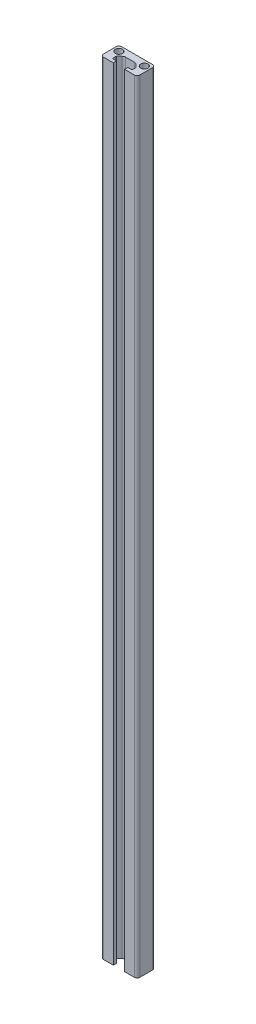
ISO-10303-21;
HEADER;
FILE_DESCRIPTION(('STEP AP214'),'2;1');
FILE_NAME('part.step','',(''),(''),'','','');
FILE_SCHEMA(('AUTOMOTIVE_DESIGN { 1 0 10303 214 1 1 1 1 }'));
ENDSEC;
DATA;
#1=APPLICATION_CONTEXT('core data for automotive mechanical design processes');
#2=APPLICATION_PROTOCOL_DEFINITION('international standard','automotive_design',2000,#1);
#3=PRODUCT_CONTEXT('',#1,'mechanical');
#4=PRODUCT('Part','Part','',(#3));
#5=PRODUCT_RELATED_PRODUCT_CATEGORY('part','',(#4));
#6=PRODUCT_DEFINITION_FORMATION('','',#4);
#7=PRODUCT_DEFINITION_CONTEXT('part definition',#1,'design');
#8=PRODUCT_DEFINITION('design','',#6,#7);
#9=PRODUCT_DEFINITION_SHAPE('','',#8);
#10=(LENGTH_UNIT() NAMED_UNIT(*) SI_UNIT(.MILLI.,.METRE.));
#11=(NAMED_UNIT(*) PLANE_ANGLE_UNIT() SI_UNIT($,.RADIAN.));
#12=(NAMED_UNIT(*) SI_UNIT($,.STERADIAN.) SOLID_ANGLE_UNIT());
#13=UNCERTAINTY_MEASURE_WITH_UNIT(LENGTH_MEASURE(1.E-05),#10,'distance_accuracy_value','');
#14=(GEOMETRIC_REPRESENTATION_CONTEXT(3) GLOBAL_UNCERTAINTY_ASSIGNED_CONTEXT((#13)) GLOBAL_UNIT_ASSIGNED_CONTEXT((#10,
#11,#12)) REPRESENTATION_CONTEXT('',''));
#15=CARTESIAN_POINT('',(0.,0.,0.));
#16=DIRECTION('',(0.,0.,1.));
#17=DIRECTION('',(1.,0.,0.));
#18=AXIS2_PLACEMENT_3D('',#15,#16,#17);
#19=CARTESIAN_POINT('',(-8.5,215.,0.));
#20=DIRECTION('',(0.,0.,-1.));
#21=DIRECTION('',(-1.,0.,0.));
#22=AXIS2_PLACEMENT_3D('',#19,#20,#21);
#23=PLANE('',#22);
#24=DIRECTION('',(1.,0.,0.));
#25=VECTOR('',#24,1.);
#26=CARTESIAN_POINT('',(-8.5,-215.,0.));
#27=LINE('',#26,#25);
#28=CARTESIAN_POINT('',(-8.5,-215.,0.));
#29=VERTEX_POINT('',#28);
#30=CARTESIAN_POINT('',(-3.1,-215.,0.));
#31=VERTEX_POINT('',#30);
#32=EDGE_CURVE('E260',#29,#31,#27,.T.);
#33=ORIENTED_EDGE('',*,*,#32,.T.);
#34=DIRECTION('',(0.,1.,0.));
#35=VECTOR('',#34,1.);
#36=CARTESIAN_POINT('',(-3.1,-215.,0.));
#37=LINE('',#36,#35);
#38=CARTESIAN_POINT('',(-3.1,215.,0.));
#39=VERTEX_POINT('',#38);
#40=EDGE_CURVE('E217',#31,#39,#37,.T.);
#41=ORIENTED_EDGE('',*,*,#40,.T.);
#42=DIRECTION('',(1.,0.,0.));
#43=VECTOR('',#42,1.);
#44=CARTESIAN_POINT('',(-8.5,215.,0.));
#45=LINE('',#44,#43);
#46=CARTESIAN_POINT('',(-8.5,215.,0.));
#47=VERTEX_POINT('',#46);
#48=EDGE_CURVE('E200',#47,#39,#45,.T.);
#49=ORIENTED_EDGE('',*,*,#48,.F.);
#50=DIRECTION('',(0.,-1.,0.));
#51=VECTOR('',#50,1.);
#52=CARTESIAN_POINT('',(-8.5,215.,0.));
#53=LINE('',#52,#51);
#54=EDGE_CURVE('E284',#47,#29,#53,.T.);
#55=ORIENTED_EDGE('',*,*,#54,.T.);
#56=EDGE_LOOP('',(#33,#41,#49,#55));
#57=FACE_BOUND('',#56,.T.);
#58=ADVANCED_FACE('F17',(#57),#23,.F.);
#59=CARTESIAN_POINT('',(-8.5,215.,-8.5));
#60=DIRECTION('',(0.,1.,0.));
#61=DIRECTION('',(0.,0.,1.));
#62=AXIS2_PLACEMENT_3D('',#59,#60,#61);
#63=PLANE('',#62);
#64=DIRECTION('',(1.,0.,0.));
#65=VECTOR('',#64,1.);
#66=CARTESIAN_POINT('',(-5.45,215.,-1.8));
#67=LINE('',#66,#65);
#68=CARTESIAN_POINT('',(-4.95,215.,-1.8));
#69=VERTEX_POINT('',#68);
#70=CARTESIAN_POINT('',(-3.1,215.,-1.8));
#71=VERTEX_POINT('',#70);
#72=EDGE_CURVE('E177',#69,#71,#67,.T.);
#73=ORIENTED_EDGE('',*,*,#72,.F.);
#74=CARTESIAN_POINT('',(-4.95,215.,-2.3));
#75=DIRECTION('',(0.,1.,0.));
#76=DIRECTION('',(0.,0.,1.));
#77=AXIS2_PLACEMENT_3D('',#74,#75,#76);
#78=CIRCLE('',#77,0.5);
#79=CARTESIAN_POINT('',(-5.45,215.,-2.3));
#80=VERTEX_POINT('',#79);
#81=EDGE_CURVE('E25',#69,#80,#78,.F.);
#82=ORIENTED_EDGE('',*,*,#81,.T.);
#83=DIRECTION('',(0.,0.,1.));
#84=VECTOR('',#83,1.);
#85=CARTESIAN_POINT('',(-5.45,215.,-3.9));
#86=LINE('',#85,#84);
#87=CARTESIAN_POINT('',(-5.45,215.,-3.69289321881346));
#88=VERTEX_POINT('',#87);
#89=EDGE_CURVE('E347',#88,#80,#86,.T.);
#90=ORIENTED_EDGE('',*,*,#89,.F.);
#91=CARTESIAN_POINT('',(-4.95,215.,-3.69289321881346));
#92=DIRECTION('',(0.,1.,0.));
#93=DIRECTION('',(0.,0.,1.));
#94=AXIS2_PLACEMENT_3D('',#91,#92,#93);
#95=CIRCLE('',#94,0.5);
#96=CARTESIAN_POINT('',(-5.30355339059327,215.,-4.04644660940673));
#97=VERTEX_POINT('',#96);
#98=EDGE_CURVE('E342',#88,#97,#95,.F.);
#99=ORIENTED_EDGE('',*,*,#98,.T.);
#100=DIRECTION('',(-0.707106781186548,0.,0.707106781186548));
#101=VECTOR('',#100,1.);
#102=CARTESIAN_POINT('',(-5.45,215.,-3.9));
#103=LINE('',#102,#101);
#104=CARTESIAN_POINT('',(-3.83578643762691,215.,-5.5142135623731));
#105=VERTEX_POINT('',#104);
#106=EDGE_CURVE('E352',#105,#97,#103,.T.);
#107=ORIENTED_EDGE('',*,*,#106,.F.);
#108=CARTESIAN_POINT('',(-2.42157287525381,215.,-4.1));
#109=DIRECTION('',(0.,1.,0.));
#110=DIRECTION('',(0.,0.,1.));
#111=AXIS2_PLACEMENT_3D('',#108,#109,#110);
#112=CIRCLE('',#111,2.);
#113=CARTESIAN_POINT('',(-2.42157287525381,215.,-6.1));
#114=VERTEX_POINT('',#113);
#115=EDGE_CURVE('E312',#105,#114,#112,.F.);
#116=ORIENTED_EDGE('',*,*,#115,.T.);
#117=DIRECTION('',(-1.,0.,0.));
#118=VECTOR('',#117,1.);
#119=CARTESIAN_POINT('',(-3.1,215.,-6.1));
#120=LINE('',#119,#118);
#121=CARTESIAN_POINT('',(2.42157287525381,215.,-6.1));
#122=VERTEX_POINT('',#121);
#123=EDGE_CURVE('E204',#122,#114,#120,.T.);
#124=ORIENTED_EDGE('',*,*,#123,.F.);
#125=CARTESIAN_POINT('',(2.42157287525381,215.,-4.1));
#126=DIRECTION('',(0.,1.,0.));
#127=DIRECTION('',(0.,0.,1.));
#128=AXIS2_PLACEMENT_3D('',#125,#126,#127);
#129=CIRCLE('',#128,2.);
#130=CARTESIAN_POINT('',(3.83578643762691,215.,-5.5142135623731));
#131=VERTEX_POINT('',#130);
#132=EDGE_CURVE('E307',#122,#131,#129,.F.);
#133=ORIENTED_EDGE('',*,*,#132,.T.);
#134=DIRECTION('',(-0.707106781186548,0.,-0.707106781186548));
#135=VECTOR('',#134,1.);
#136=CARTESIAN_POINT('',(3.25,215.,-6.1));
#137=LINE('',#136,#135);
#138=CARTESIAN_POINT('',(5.30355339059327,215.,-4.04644660940673));
#139=VERTEX_POINT('',#138);
#140=EDGE_CURVE('E441',#139,#131,#137,.T.);
#141=ORIENTED_EDGE('',*,*,#140,.F.);
#142=CARTESIAN_POINT('',(4.95,215.,-3.69289321881346));
#143=DIRECTION('',(0.,1.,0.));
#144=DIRECTION('',(0.,0.,1.));
#145=AXIS2_PLACEMENT_3D('',#142,#143,#144);
#146=CIRCLE('',#145,0.5);
#147=CARTESIAN_POINT('',(5.45,215.,-3.69289321881346));
#148=VERTEX_POINT('',#147);
#149=EDGE_CURVE('E334',#139,#148,#146,.F.);
#150=ORIENTED_EDGE('',*,*,#149,.T.);
#151=DIRECTION('',(0.,0.,-1.));
#152=VECTOR('',#151,1.);
#153=CARTESIAN_POINT('',(5.45,215.,-3.9));
#154=LINE('',#153,#152);
#155=CARTESIAN_POINT('',(5.45,215.,-2.3));
#156=VERTEX_POINT('',#155);
#157=EDGE_CURVE('E443',#156,#148,#154,.T.);
#158=ORIENTED_EDGE('',*,*,#157,.F.);
#159=CARTESIAN_POINT('',(4.95,215.,-2.3));
#160=DIRECTION('',(0.,1.,0.));
#161=DIRECTION('',(0.,0.,1.));
#162=AXIS2_PLACEMENT_3D('',#159,#160,#161);
#163=CIRCLE('',#162,0.5);
#164=CARTESIAN_POINT('',(4.95,215.,-1.8));
#165=VERTEX_POINT('',#164);
#166=EDGE_CURVE('E338',#156,#165,#163,.F.);
#167=ORIENTED_EDGE('',*,*,#166,.T.);
#168=CARTESIAN_POINT('',(3.1,215.,-1.8));
#169=VERTEX_POINT('',#168);
#170=EDGE_CURVE('E186',#169,#165,#67,.T.);
#171=ORIENTED_EDGE('',*,*,#170,.F.);
#172=DIRECTION('',(0.,0.,-1.));
#173=VECTOR('',#172,1.);
#174=CARTESIAN_POINT('',(3.1,215.,-6.1));
#175=LINE('',#174,#173);
#176=CARTESIAN_POINT('',(3.1,215.,0.));
#177=VERTEX_POINT('',#176);
#178=EDGE_CURVE('E201',#177,#169,#175,.T.);
#179=ORIENTED_EDGE('',*,*,#178,.F.);
#180=CARTESIAN_POINT('',(8.5,215.,0.));
#181=VERTEX_POINT('',#180);
#182=EDGE_CURVE('E242',#177,#181,#45,.T.);
#183=ORIENTED_EDGE('',*,*,#182,.T.);
#184=CARTESIAN_POINT('',(8.5,215.,-1.5));
#185=DIRECTION('',(0.,1.,0.));
#186=DIRECTION('',(0.,0.,1.));
#187=AXIS2_PLACEMENT_3D('',#184,#185,#186);
#188=CIRCLE('',#187,1.5);
#189=CARTESIAN_POINT('',(10.,215.,-1.5));
#190=VERTEX_POINT('',#189);
#191=EDGE_CURVE('E244',#181,#190,#188,.T.);
#192=ORIENTED_EDGE('',*,*,#191,.T.);
#193=DIRECTION('',(0.,0.,-1.));
#194=VECTOR('',#193,1.);
#195=CARTESIAN_POINT('',(10.,215.,-8.5));
#196=LINE('',#195,#194);
#197=CARTESIAN_POINT('',(10.,215.,-8.5));
#198=VERTEX_POINT('',#197);
#199=EDGE_CURVE('E246',#190,#198,#196,.T.);
#200=ORIENTED_EDGE('',*,*,#199,.T.);
#201=CARTESIAN_POINT('',(8.5,215.,-8.5));
#202=DIRECTION('',(0.,1.,0.));
#203=DIRECTION('',(0.,0.,-1.));
#204=AXIS2_PLACEMENT_3D('',#201,#202,#203);
#205=CIRCLE('',#204,1.5);
#206=CARTESIAN_POINT('',(8.5,215.,-10.));
#207=VERTEX_POINT('',#206);
#208=EDGE_CURVE('E248',#198,#207,#205,.T.);
#209=ORIENTED_EDGE('',*,*,#208,.T.);
#210=DIRECTION('',(-1.,0.,0.));
#211=VECTOR('',#210,1.);
#212=CARTESIAN_POINT('',(-8.5,215.,-10.));
#213=LINE('',#212,#211);
#214=CARTESIAN_POINT('',(-8.5,215.,-10.));
#215=VERTEX_POINT('',#214);
#216=EDGE_CURVE('E250',#207,#215,#213,.T.);
#217=ORIENTED_EDGE('',*,*,#216,.T.);
#218=CARTESIAN_POINT('',(-8.5,215.,-8.5));
#219=DIRECTION('',(0.,1.,0.));
#220=DIRECTION('',(0.,0.,1.));
#221=AXIS2_PLACEMENT_3D('',#218,#219,#220);
#222=CIRCLE('',#221,1.5);
#223=CARTESIAN_POINT('',(-10.,215.,-8.5));
#224=VERTEX_POINT('',#223);
#225=EDGE_CURVE('E234',#215,#224,#222,.T.);
#226=ORIENTED_EDGE('',*,*,#225,.T.);
#227=DIRECTION('',(0.,0.,1.));
#228=VECTOR('',#227,1.);
#229=CARTESIAN_POINT('',(-10.,215.,-8.5));
#230=LINE('',#229,#228);
#231=CARTESIAN_POINT('',(-10.,215.,-1.5));
#232=VERTEX_POINT('',#231);
#233=EDGE_CURVE('E237',#224,#232,#230,.T.);
#234=ORIENTED_EDGE('',*,*,#233,.T.);
#235=CARTESIAN_POINT('',(-8.5,215.,-1.5));
#236=DIRECTION('',(0.,1.,0.));
#237=DIRECTION('',(0.,0.,1.));
#238=AXIS2_PLACEMENT_3D('',#235,#236,#237);
#239=CIRCLE('',#238,1.5);
#240=EDGE_CURVE('E240',#232,#47,#239,.T.);
#241=ORIENTED_EDGE('',*,*,#240,.T.);
#242=ORIENTED_EDGE('',*,*,#48,.T.);
#243=DIRECTION('',(0.,0.,1.));
#244=VECTOR('',#243,1.);
#245=CARTESIAN_POINT('',(-3.1,215.,-6.1));
#246=LINE('',#245,#244);
#247=EDGE_CURVE('E191',#71,#39,#246,.T.);
#248=ORIENTED_EDGE('',*,*,#247,.F.);
#249=EDGE_LOOP('',(#73,#82,#90,#99,#107,#116,#124,#133,#141,#150,#158,#167,#171,#179,#183,#192,
#200,#209,#217,#226,#234,#241,#242,#248));
#250=FACE_BOUND('',#249,.T.);
#251=CARTESIAN_POINT('',(-7.,215.,-7.));
#252=DIRECTION('',(0.,1.,0.));
#253=DIRECTION('',(0.,0.,1.));
#254=AXIS2_PLACEMENT_3D('',#251,#252,#253);
#255=CIRCLE('',#254,2.);
#256=CARTESIAN_POINT('',(-7.,215.,-5.));
#257=VERTEX_POINT('',#256);
#258=EDGE_CURVE('E228',#257,#257,#255,.T.);
#259=ORIENTED_EDGE('',*,*,#258,.F.);
#260=EDGE_LOOP('',(#259));
#261=FACE_BOUND('',#260,.T.);
#262=CARTESIAN_POINT('',(7.,215.,-7.));
#263=DIRECTION('',(0.,1.,0.));
#264=DIRECTION('',(0.,0.,1.));
#265=AXIS2_PLACEMENT_3D('',#262,#263,#264);
#266=CIRCLE('',#265,2.);
#267=CARTESIAN_POINT('',(7.,215.,-5.));
#268=VERTEX_POINT('',#267);
#269=EDGE_CURVE('E222',#268,#268,#266,.T.);
#270=ORIENTED_EDGE('',*,*,#269,.F.);
#271=EDGE_LOOP('',(#270));
#272=FACE_BOUND('',#271,.T.);
#273=ADVANCED_FACE('F197',(#250,#261,#272),#63,.T.);
#274=CARTESIAN_POINT('',(-8.5,-215.,-8.5));
#275=DIRECTION('',(0.,1.,0.));
#276=DIRECTION('',(0.,0.,1.));
#277=AXIS2_PLACEMENT_3D('',#274,#275,#276);
#278=PLANE('',#277);
#279=DIRECTION('',(-0.707106781186548,0.,0.707106781186548));
#280=VECTOR('',#279,1.);
#281=CARTESIAN_POINT('',(-5.45,-215.,-3.9));
#282=LINE('',#281,#280);
#283=CARTESIAN_POINT('',(-3.83578643762691,-215.,-5.5142135623731));
#284=VERTEX_POINT('',#283);
#285=CARTESIAN_POINT('',(-5.30355339059327,-215.,-4.04644660940673));
#286=VERTEX_POINT('',#285);
#287=EDGE_CURVE('E433',#284,#286,#282,.T.);
#288=ORIENTED_EDGE('',*,*,#287,.T.);
#289=CARTESIAN_POINT('',(-4.95,-215.,-3.69289321881346));
#290=DIRECTION('',(0.,1.,0.));
#291=DIRECTION('',(0.,0.,1.));
#292=AXIS2_PLACEMENT_3D('',#289,#290,#291);
#293=CIRCLE('',#292,0.5);
#294=CARTESIAN_POINT('',(-5.45,-215.,-3.69289321881346));
#295=VERTEX_POINT('',#294);
#296=EDGE_CURVE('E344',#286,#295,#293,.T.);
#297=ORIENTED_EDGE('',*,*,#296,.T.);
#298=DIRECTION('',(0.,0.,1.));
#299=VECTOR('',#298,1.);
#300=CARTESIAN_POINT('',(-5.45,-215.,-3.9));
#301=LINE('',#300,#299);
#302=CARTESIAN_POINT('',(-5.45,-215.,-2.3));
#303=VERTEX_POINT('',#302);
#304=EDGE_CURVE('E430',#295,#303,#301,.T.);
#305=ORIENTED_EDGE('',*,*,#304,.T.);
#306=CARTESIAN_POINT('',(-4.95,-215.,-2.3));
#307=DIRECTION('',(0.,1.,0.));
#308=DIRECTION('',(0.,0.,1.));
#309=AXIS2_PLACEMENT_3D('',#306,#307,#308);
#310=CIRCLE('',#309,0.5);
#311=CARTESIAN_POINT('',(-4.95,-215.,-1.8));
#312=VERTEX_POINT('',#311);
#313=EDGE_CURVE('E11',#303,#312,#310,.T.);
#314=ORIENTED_EDGE('',*,*,#313,.T.);
#315=DIRECTION('',(1.,0.,0.));
#316=VECTOR('',#315,1.);
#317=CARTESIAN_POINT('',(-5.45,-215.,-1.8));
#318=LINE('',#317,#316);
#319=CARTESIAN_POINT('',(-3.1,-215.,-1.8));
#320=VERTEX_POINT('',#319);
#321=EDGE_CURVE('E194',#312,#320,#318,.T.);
#322=ORIENTED_EDGE('',*,*,#321,.T.);
#323=DIRECTION('',(0.,0.,1.));
#324=VECTOR('',#323,1.);
#325=CARTESIAN_POINT('',(-3.1,-215.,-6.1));
#326=LINE('',#325,#324);
#327=EDGE_CURVE('E193',#320,#31,#326,.T.);
#328=ORIENTED_EDGE('',*,*,#327,.T.);
#329=ORIENTED_EDGE('',*,*,#32,.F.);
#330=CARTESIAN_POINT('',(-8.5,-215.,-1.5));
#331=DIRECTION('',(0.,1.,0.));
#332=DIRECTION('',(0.,0.,1.));
#333=AXIS2_PLACEMENT_3D('',#330,#331,#332);
#334=CIRCLE('',#333,1.5);
#335=CARTESIAN_POINT('',(-10.,-215.,-1.5));
#336=VERTEX_POINT('',#335);
#337=EDGE_CURVE('E257',#336,#29,#334,.T.);
#338=ORIENTED_EDGE('',*,*,#337,.F.);
#339=DIRECTION('',(0.,0.,1.));
#340=VECTOR('',#339,1.);
#341=CARTESIAN_POINT('',(-10.,-215.,-8.5));
#342=LINE('',#341,#340);
#343=CARTESIAN_POINT('',(-10.,-215.,-8.5));
#344=VERTEX_POINT('',#343);
#345=EDGE_CURVE('E255',#344,#336,#342,.T.);
#346=ORIENTED_EDGE('',*,*,#345,.F.);
#347=CARTESIAN_POINT('',(-8.5,-215.,-8.5));
#348=DIRECTION('',(0.,1.,0.));
#349=DIRECTION('',(0.,0.,1.));
#350=AXIS2_PLACEMENT_3D('',#347,#348,#349);
#351=CIRCLE('',#350,1.5);
#352=CARTESIAN_POINT('',(-8.5,-215.,-10.));
#353=VERTEX_POINT('',#352);
#354=EDGE_CURVE('E231',#353,#344,#351,.T.);
#355=ORIENTED_EDGE('',*,*,#354,.F.);
#356=DIRECTION('',(-1.,0.,0.));
#357=VECTOR('',#356,1.);
#358=CARTESIAN_POINT('',(-8.5,-215.,-10.));
#359=LINE('',#358,#357);
#360=CARTESIAN_POINT('',(8.5,-215.,-10.));
#361=VERTEX_POINT('',#360);
#362=EDGE_CURVE('E238',#361,#353,#359,.T.);
#363=ORIENTED_EDGE('',*,*,#362,.F.);
#364=CARTESIAN_POINT('',(8.5,-215.,-8.5));
#365=DIRECTION('',(0.,1.,0.));
#366=DIRECTION('',(0.,0.,-1.));
#367=AXIS2_PLACEMENT_3D('',#364,#365,#366);
#368=CIRCLE('',#367,1.5);
#369=CARTESIAN_POINT('',(10.,-215.,-8.5));
#370=VERTEX_POINT('',#369);
#371=EDGE_CURVE('E267',#370,#361,#368,.T.);
#372=ORIENTED_EDGE('',*,*,#371,.F.);
#373=DIRECTION('',(0.,0.,-1.));
#374=VECTOR('',#373,1.);
#375=CARTESIAN_POINT('',(10.,-215.,-8.5));
#376=LINE('',#375,#374);
#377=CARTESIAN_POINT('',(10.,-215.,-1.5));
#378=VERTEX_POINT('',#377);
#379=EDGE_CURVE('E265',#378,#370,#376,.T.);
#380=ORIENTED_EDGE('',*,*,#379,.F.);
#381=CARTESIAN_POINT('',(8.5,-215.,-1.5));
#382=DIRECTION('',(0.,1.,0.));
#383=DIRECTION('',(0.,0.,1.));
#384=AXIS2_PLACEMENT_3D('',#381,#382,#383);
#385=CIRCLE('',#384,1.5);
#386=CARTESIAN_POINT('',(8.5,-215.,0.));
#387=VERTEX_POINT('',#386);
#388=EDGE_CURVE('E263',#387,#378,#385,.T.);
#389=ORIENTED_EDGE('',*,*,#388,.F.);
#390=CARTESIAN_POINT('',(3.1,-215.,0.));
#391=VERTEX_POINT('',#390);
#392=EDGE_CURVE('E259',#391,#387,#27,.T.);
#393=ORIENTED_EDGE('',*,*,#392,.F.);
#394=DIRECTION('',(0.,0.,-1.));
#395=VECTOR('',#394,1.);
#396=CARTESIAN_POINT('',(3.1,-215.,-6.1));
#397=LINE('',#396,#395);
#398=CARTESIAN_POINT('',(3.1,-215.,-1.8));
#399=VERTEX_POINT('',#398);
#400=EDGE_CURVE('E211',#391,#399,#397,.T.);
#401=ORIENTED_EDGE('',*,*,#400,.T.);
#402=CARTESIAN_POINT('',(4.95,-215.,-1.8));
#403=VERTEX_POINT('',#402);
#404=EDGE_CURVE('E402',#399,#403,#318,.T.);
#405=ORIENTED_EDGE('',*,*,#404,.T.);
#406=CARTESIAN_POINT('',(4.95,-215.,-2.3));
#407=DIRECTION('',(0.,1.,0.));
#408=DIRECTION('',(0.,0.,1.));
#409=AXIS2_PLACEMENT_3D('',#406,#407,#408);
#410=CIRCLE('',#409,0.5);
#411=CARTESIAN_POINT('',(5.45,-215.,-2.3));
#412=VERTEX_POINT('',#411);
#413=EDGE_CURVE('E340',#403,#412,#410,.T.);
#414=ORIENTED_EDGE('',*,*,#413,.T.);
#415=DIRECTION('',(0.,0.,-1.));
#416=VECTOR('',#415,1.);
#417=CARTESIAN_POINT('',(5.45,-215.,-3.9));
#418=LINE('',#417,#416);
#419=CARTESIAN_POINT('',(5.45,-215.,-3.69289321881346));
#420=VERTEX_POINT('',#419);
#421=EDGE_CURVE('E185',#412,#420,#418,.T.);
#422=ORIENTED_EDGE('',*,*,#421,.T.);
#423=CARTESIAN_POINT('',(4.95,-215.,-3.69289321881346));
#424=DIRECTION('',(0.,1.,0.));
#425=DIRECTION('',(0.,0.,1.));
#426=AXIS2_PLACEMENT_3D('',#423,#424,#425);
#427=CIRCLE('',#426,0.5);
#428=CARTESIAN_POINT('',(5.30355339059327,-215.,-4.04644660940673));
#429=VERTEX_POINT('',#428);
#430=EDGE_CURVE('E336',#420,#429,#427,.T.);
#431=ORIENTED_EDGE('',*,*,#430,.T.);
#432=DIRECTION('',(-0.707106781186548,0.,-0.707106781186548));
#433=VECTOR('',#432,1.);
#434=CARTESIAN_POINT('',(3.25,-215.,-6.1));
#435=LINE('',#434,#433);
#436=CARTESIAN_POINT('',(3.83578643762691,-215.,-5.5142135623731));
#437=VERTEX_POINT('',#436);
#438=EDGE_CURVE('E435',#429,#437,#435,.T.);
#439=ORIENTED_EDGE('',*,*,#438,.T.);
#440=CARTESIAN_POINT('',(2.42157287525381,-215.,-4.1));
#441=DIRECTION('',(0.,1.,0.));
#442=DIRECTION('',(0.,0.,1.));
#443=AXIS2_PLACEMENT_3D('',#440,#441,#442);
#444=CIRCLE('',#443,2.);
#445=CARTESIAN_POINT('',(2.42157287525381,-215.,-6.1));
#446=VERTEX_POINT('',#445);
#447=EDGE_CURVE('E310',#437,#446,#444,.T.);
#448=ORIENTED_EDGE('',*,*,#447,.T.);
#449=DIRECTION('',(-1.,0.,0.));
#450=VECTOR('',#449,1.);
#451=CARTESIAN_POINT('',(-3.1,-215.,-6.1));
#452=LINE('',#451,#450);
#453=CARTESIAN_POINT('',(-2.42157287525381,-215.,-6.1));
#454=VERTEX_POINT('',#453);
#455=EDGE_CURVE('E214',#446,#454,#452,.T.);
#456=ORIENTED_EDGE('',*,*,#455,.T.);
#457=CARTESIAN_POINT('',(-2.42157287525381,-215.,-4.1));
#458=DIRECTION('',(0.,1.,0.));
#459=DIRECTION('',(0.,0.,1.));
#460=AXIS2_PLACEMENT_3D('',#457,#458,#459);
#461=CIRCLE('',#460,2.);
#462=EDGE_CURVE('E314',#454,#284,#461,.T.);
#463=ORIENTED_EDGE('',*,*,#462,.T.);
#464=EDGE_LOOP('',(#288,#297,#305,#314,#322,#328,#329,#338,#346,#355,#363,#372,#380,#389,#393,
#401,#405,#414,#422,#431,#439,#448,#456,#463));
#465=FACE_BOUND('',#464,.T.);
#466=CARTESIAN_POINT('',(-7.,-215.,-7.));
#467=DIRECTION('',(0.,1.,0.));
#468=DIRECTION('',(0.,0.,1.));
#469=AXIS2_PLACEMENT_3D('',#466,#467,#468);
#470=CIRCLE('',#469,2.);
#471=CARTESIAN_POINT('',(-7.,-215.,-5.));
#472=VERTEX_POINT('',#471);
#473=EDGE_CURVE('E225',#472,#472,#470,.T.);
#474=ORIENTED_EDGE('',*,*,#473,.T.);
#475=EDGE_LOOP('',(#474));
#476=FACE_BOUND('',#475,.T.);
#477=CARTESIAN_POINT('',(7.,-215.,-7.));
#478=DIRECTION('',(0.,1.,0.));
#479=DIRECTION('',(0.,0.,1.));
#480=AXIS2_PLACEMENT_3D('',#477,#478,#479);
#481=CIRCLE('',#480,2.);
#482=CARTESIAN_POINT('',(7.,-215.,-5.));
#483=VERTEX_POINT('',#482);
#484=EDGE_CURVE('E220',#483,#483,#481,.T.);
#485=ORIENTED_EDGE('',*,*,#484,.T.);
#486=EDGE_LOOP('',(#485));
#487=FACE_BOUND('',#486,.T.);
#488=ADVANCED_FACE('F371',(#465,#476,#487),#278,.F.);
#489=CARTESIAN_POINT('',(-8.5,215.,-8.5));
#490=DIRECTION('',(0.,-1.,0.));
#491=DIRECTION('',(0.,0.,-1.));
#492=AXIS2_PLACEMENT_3D('',#489,#490,#491);
#493=CYLINDRICAL_SURFACE('',#492,1.5);
#494=ORIENTED_EDGE('',*,*,#354,.T.);
#495=DIRECTION('',(0.,-1.,0.));
#496=VECTOR('',#495,1.);
#497=CARTESIAN_POINT('',(-10.,215.,-8.5));
#498=LINE('',#497,#496);
#499=EDGE_CURVE('E290',#224,#344,#498,.T.);
#500=ORIENTED_EDGE('',*,*,#499,.F.);
#501=ORIENTED_EDGE('',*,*,#225,.F.);
#502=DIRECTION('',(0.,-1.,0.));
#503=VECTOR('',#502,1.);
#504=CARTESIAN_POINT('',(-8.5,215.,-10.));
#505=LINE('',#504,#503);
#506=EDGE_CURVE('E252',#215,#353,#505,.T.);
#507=ORIENTED_EDGE('',*,*,#506,.T.);
#508=EDGE_LOOP('',(#494,#500,#501,#507));
#509=FACE_BOUND('',#508,.T.);
#510=ADVANCED_FACE('F423',(#509),#493,.T.);
#511=CARTESIAN_POINT('',(-10.,215.,-8.5));
#512=DIRECTION('',(1.,0.,0.));
#513=DIRECTION('',(0.,0.,-1.));
#514=AXIS2_PLACEMENT_3D('',#511,#512,#513);
#515=PLANE('',#514);
#516=ORIENTED_EDGE('',*,*,#345,.T.);
#517=DIRECTION('',(0.,-1.,0.));
#518=VECTOR('',#517,1.);
#519=CARTESIAN_POINT('',(-10.,215.,-1.5));
#520=LINE('',#519,#518);
#521=EDGE_CURVE('E287',#232,#336,#520,.T.);
#522=ORIENTED_EDGE('',*,*,#521,.F.);
#523=ORIENTED_EDGE('',*,*,#233,.F.);
#524=ORIENTED_EDGE('',*,*,#499,.T.);
#525=EDGE_LOOP('',(#516,#522,#523,#524));
#526=FACE_BOUND('',#525,.T.);
#527=ADVANCED_FACE('F386',(#526),#515,.F.);
#528=CARTESIAN_POINT('',(-8.5,215.,-1.5));
#529=DIRECTION('',(0.,-1.,0.));
#530=DIRECTION('',(0.,0.,-1.));
#531=AXIS2_PLACEMENT_3D('',#528,#529,#530);
#532=CYLINDRICAL_SURFACE('',#531,1.5);
#533=ORIENTED_EDGE('',*,*,#337,.T.);
#534=ORIENTED_EDGE('',*,*,#54,.F.);
#535=ORIENTED_EDGE('',*,*,#240,.F.);
#536=ORIENTED_EDGE('',*,*,#521,.T.);
#537=EDGE_LOOP('',(#533,#534,#535,#536));
#538=FACE_BOUND('',#537,.T.);
#539=ADVANCED_FACE('F377',(#538),#532,.T.);
#540=ORIENTED_EDGE('',*,*,#182,.F.);
#541=DIRECTION('',(0.,1.,0.));
#542=VECTOR('',#541,1.);
#543=CARTESIAN_POINT('',(3.1,-215.,0.));
#544=LINE('',#543,#542);
#545=EDGE_CURVE('E218',#391,#177,#544,.T.);
#546=ORIENTED_EDGE('',*,*,#545,.F.);
#547=ORIENTED_EDGE('',*,*,#392,.T.);
#548=DIRECTION('',(0.,-1.,0.));
#549=VECTOR('',#548,1.);
#550=CARTESIAN_POINT('',(8.5,215.,0.));
#551=LINE('',#550,#549);
#552=EDGE_CURVE('E281',#181,#387,#551,.T.);
#553=ORIENTED_EDGE('',*,*,#552,.F.);
#554=EDGE_LOOP('',(#540,#546,#547,#553));
#555=FACE_BOUND('',#554,.T.);
#556=ADVANCED_FACE('F366',(#555),#23,.F.);
#557=CARTESIAN_POINT('',(8.5,215.,-1.5));
#558=DIRECTION('',(0.,-1.,0.));
#559=DIRECTION('',(0.,0.,-1.));
#560=AXIS2_PLACEMENT_3D('',#557,#558,#559);
#561=CYLINDRICAL_SURFACE('',#560,1.5);
#562=ORIENTED_EDGE('',*,*,#388,.T.);
#563=DIRECTION('',(0.,-1.,0.));
#564=VECTOR('',#563,1.);
#565=CARTESIAN_POINT('',(10.,215.,-1.5));
#566=LINE('',#565,#564);
#567=EDGE_CURVE('E278',#190,#378,#566,.T.);
#568=ORIENTED_EDGE('',*,*,#567,.F.);
#569=ORIENTED_EDGE('',*,*,#191,.F.);
#570=ORIENTED_EDGE('',*,*,#552,.T.);
#571=EDGE_LOOP('',(#562,#568,#569,#570));
#572=FACE_BOUND('',#571,.T.);
#573=ADVANCED_FACE('F376',(#572),#561,.T.);
#574=CARTESIAN_POINT('',(10.,215.,-8.5));
#575=DIRECTION('',(-1.,0.,0.));
#576=DIRECTION('',(0.,0.,1.));
#577=AXIS2_PLACEMENT_3D('',#574,#575,#576);
#578=PLANE('',#577);
#579=ORIENTED_EDGE('',*,*,#379,.T.);
#580=DIRECTION('',(0.,-1.,0.));
#581=VECTOR('',#580,1.);
#582=CARTESIAN_POINT('',(10.,215.,-8.5));
#583=LINE('',#582,#581);
#584=EDGE_CURVE('E275',#198,#370,#583,.T.);
#585=ORIENTED_EDGE('',*,*,#584,.F.);
#586=ORIENTED_EDGE('',*,*,#199,.F.);
#587=ORIENTED_EDGE('',*,*,#567,.T.);
#588=EDGE_LOOP('',(#579,#585,#586,#587));
#589=FACE_BOUND('',#588,.T.);
#590=ADVANCED_FACE('F384',(#589),#578,.F.);
#591=CARTESIAN_POINT('',(8.5,215.,-8.5));
#592=DIRECTION('',(0.,-1.,0.));
#593=DIRECTION('',(0.,0.,-1.));
#594=AXIS2_PLACEMENT_3D('',#591,#592,#593);
#595=CYLINDRICAL_SURFACE('',#594,1.5);
#596=ORIENTED_EDGE('',*,*,#371,.T.);
#597=DIRECTION('',(0.,-1.,0.));
#598=VECTOR('',#597,1.);
#599=CARTESIAN_POINT('',(8.5,215.,-10.));
#600=LINE('',#599,#598);
#601=EDGE_CURVE('E272',#207,#361,#600,.T.);
#602=ORIENTED_EDGE('',*,*,#601,.F.);
#603=ORIENTED_EDGE('',*,*,#208,.F.);
#604=ORIENTED_EDGE('',*,*,#584,.T.);
#605=EDGE_LOOP('',(#596,#602,#603,#604));
#606=FACE_BOUND('',#605,.T.);
#607=ADVANCED_FACE('F414',(#606),#595,.T.);
#608=CARTESIAN_POINT('',(-8.5,215.,-10.));
#609=DIRECTION('',(0.,0.,1.));
#610=DIRECTION('',(1.,0.,0.));
#611=AXIS2_PLACEMENT_3D('',#608,#609,#610);
#612=PLANE('',#611);
#613=ORIENTED_EDGE('',*,*,#362,.T.);
#614=ORIENTED_EDGE('',*,*,#506,.F.);
#615=ORIENTED_EDGE('',*,*,#216,.F.);
#616=ORIENTED_EDGE('',*,*,#601,.T.);
#617=EDGE_LOOP('',(#613,#614,#615,#616));
#618=FACE_BOUND('',#617,.T.);
#619=ADVANCED_FACE('F418',(#618),#612,.F.);
#620=CARTESIAN_POINT('',(-7.,215.,-7.));
#621=DIRECTION('',(0.,-1.,0.));
#622=DIRECTION('',(0.,0.,-1.));
#623=AXIS2_PLACEMENT_3D('',#620,#621,#622);
#624=CYLINDRICAL_SURFACE('',#623,2.);
#625=ORIENTED_EDGE('',*,*,#258,.T.);
#626=EDGE_LOOP('',(#625));
#627=FACE_BOUND('',#626,.T.);
#628=ORIENTED_EDGE('',*,*,#473,.F.);
#629=EDGE_LOOP('',(#628));
#630=FACE_BOUND('',#629,.T.);
#631=ADVANCED_FACE('F504',(#627,#630),#624,.F.);
#632=CARTESIAN_POINT('',(7.,215.,-7.));
#633=DIRECTION('',(0.,-1.,0.));
#634=DIRECTION('',(0.,0.,-1.));
#635=AXIS2_PLACEMENT_3D('',#632,#633,#634);
#636=CYLINDRICAL_SURFACE('',#635,2.);
#637=ORIENTED_EDGE('',*,*,#269,.T.);
#638=EDGE_LOOP('',(#637));
#639=FACE_BOUND('',#638,.T.);
#640=ORIENTED_EDGE('',*,*,#484,.F.);
#641=EDGE_LOOP('',(#640));
#642=FACE_BOUND('',#641,.T.);
#643=ADVANCED_FACE('F501',(#639,#642),#636,.F.);
#644=CARTESIAN_POINT('',(-3.1,-215.,-6.1));
#645=DIRECTION('',(-1.,0.,0.));
#646=DIRECTION('',(0.,0.,1.));
#647=AXIS2_PLACEMENT_3D('',#644,#645,#646);
#648=PLANE('',#647);
#649=ORIENTED_EDGE('',*,*,#327,.F.);
#650=DIRECTION('',(0.,1.,0.));
#651=VECTOR('',#650,1.);
#652=CARTESIAN_POINT('',(-3.1,-215.,-1.8));
#653=LINE('',#652,#651);
#654=EDGE_CURVE('E180',#320,#71,#653,.T.);
#655=ORIENTED_EDGE('',*,*,#654,.T.);
#656=ORIENTED_EDGE('',*,*,#247,.T.);
#657=ORIENTED_EDGE('',*,*,#40,.F.);
#658=EDGE_LOOP('',(#649,#655,#656,#657));
#659=FACE_BOUND('',#658,.T.);
#660=ADVANCED_FACE('F189',(#659),#648,.F.);
#661=CARTESIAN_POINT('',(-3.1,-215.,-6.1));
#662=DIRECTION('',(0.,0.,-1.));
#663=DIRECTION('',(-1.,0.,0.));
#664=AXIS2_PLACEMENT_3D('',#661,#662,#663);
#665=PLANE('',#664);
#666=ORIENTED_EDGE('',*,*,#455,.F.);
#667=DIRECTION('',(0.,1.,0.));
#668=VECTOR('',#667,1.);
#669=CARTESIAN_POINT('',(2.42157287525381,215.,-6.1));
#670=LINE('',#669,#668);
#671=EDGE_CURVE('E298',#446,#122,#670,.T.);
#672=ORIENTED_EDGE('',*,*,#671,.T.);
#673=ORIENTED_EDGE('',*,*,#123,.T.);
#674=DIRECTION('',(0.,1.,0.));
#675=VECTOR('',#674,1.);
#676=CARTESIAN_POINT('',(-2.42157287525381,-215.,-6.1));
#677=LINE('',#676,#675);
#678=EDGE_CURVE('E296',#114,#454,#677,.F.);
#679=ORIENTED_EDGE('',*,*,#678,.T.);
#680=EDGE_LOOP('',(#666,#672,#673,#679));
#681=FACE_BOUND('',#680,.T.);
#682=ADVANCED_FACE('F467',(#681),#665,.F.);
#683=CARTESIAN_POINT('',(3.1,-215.,-6.1));
#684=DIRECTION('',(1.,0.,0.));
#685=DIRECTION('',(0.,0.,-1.));
#686=AXIS2_PLACEMENT_3D('',#683,#684,#685);
#687=PLANE('',#686);
#688=ORIENTED_EDGE('',*,*,#178,.T.);
#689=DIRECTION('',(0.,-1.,0.));
#690=VECTOR('',#689,1.);
#691=CARTESIAN_POINT('',(3.1,-215.,-1.8));
#692=LINE('',#691,#690);
#693=EDGE_CURVE('E293',#169,#399,#692,.T.);
#694=ORIENTED_EDGE('',*,*,#693,.T.);
#695=ORIENTED_EDGE('',*,*,#400,.F.);
#696=ORIENTED_EDGE('',*,*,#545,.T.);
#697=EDGE_LOOP('',(#688,#694,#695,#696));
#698=FACE_BOUND('',#697,.T.);
#699=ADVANCED_FACE('F398',(#698),#687,.F.);
#700=CARTESIAN_POINT('',(-5.45,-215.,-1.8));
#701=DIRECTION('',(0.,0.,1.));
#702=DIRECTION('',(1.,0.,0.));
#703=AXIS2_PLACEMENT_3D('',#700,#701,#702);
#704=PLANE('',#703);
#705=ORIENTED_EDGE('',*,*,#170,.T.);
#706=DIRECTION('',(0.,1.,0.));
#707=VECTOR('',#706,1.);
#708=CARTESIAN_POINT('',(4.95,-215.,-1.8));
#709=LINE('',#708,#707);
#710=EDGE_CURVE('E324',#165,#403,#709,.F.);
#711=ORIENTED_EDGE('',*,*,#710,.T.);
#712=ORIENTED_EDGE('',*,*,#404,.F.);
#713=ORIENTED_EDGE('',*,*,#693,.F.);
#714=EDGE_LOOP('',(#705,#711,#712,#713));
#715=FACE_BOUND('',#714,.T.);
#716=ADVANCED_FACE('F492',(#715),#704,.F.);
#717=CARTESIAN_POINT('',(3.25,-215.,-6.1));
#718=DIRECTION('',(0.707106781186548,0.,-0.707106781186548));
#719=DIRECTION('',(-0.707106781186548,0.,-0.707106781186548));
#720=AXIS2_PLACEMENT_3D('',#717,#718,#719);
#721=PLANE('',#720);
#722=ORIENTED_EDGE('',*,*,#438,.F.);
#723=DIRECTION('',(0.,1.,0.));
#724=VECTOR('',#723,1.);
#725=CARTESIAN_POINT('',(5.30355339059327,215.,-4.04644660940673));
#726=LINE('',#725,#724);
#727=EDGE_CURVE('E316',#429,#139,#726,.T.);
#728=ORIENTED_EDGE('',*,*,#727,.T.);
#729=ORIENTED_EDGE('',*,*,#140,.T.);
#730=DIRECTION('',(0.,1.,0.));
#731=VECTOR('',#730,1.);
#732=CARTESIAN_POINT('',(3.83578643762691,-215.,-5.5142135623731));
#733=LINE('',#732,#731);
#734=EDGE_CURVE('E301',#131,#437,#733,.F.);
#735=ORIENTED_EDGE('',*,*,#734,.T.);
#736=EDGE_LOOP('',(#722,#728,#729,#735));
#737=FACE_BOUND('',#736,.T.);
#738=ADVANCED_FACE('F457',(#737),#721,.F.);
#739=CARTESIAN_POINT('',(5.45,-215.,-3.9));
#740=DIRECTION('',(1.,0.,0.));
#741=DIRECTION('',(0.,0.,-1.));
#742=AXIS2_PLACEMENT_3D('',#739,#740,#741);
#743=PLANE('',#742);
#744=ORIENTED_EDGE('',*,*,#157,.T.);
#745=DIRECTION('',(0.,1.,0.));
#746=VECTOR('',#745,1.);
#747=CARTESIAN_POINT('',(5.45,-215.,-3.69289321881346));
#748=LINE('',#747,#746);
#749=EDGE_CURVE('E322',#148,#420,#748,.F.);
#750=ORIENTED_EDGE('',*,*,#749,.T.);
#751=ORIENTED_EDGE('',*,*,#421,.F.);
#752=DIRECTION('',(0.,1.,0.));
#753=VECTOR('',#752,1.);
#754=CARTESIAN_POINT('',(5.45,215.,-2.3));
#755=LINE('',#754,#753);
#756=EDGE_CURVE('E319',#412,#156,#755,.T.);
#757=ORIENTED_EDGE('',*,*,#756,.T.);
#758=EDGE_LOOP('',(#744,#750,#751,#757));
#759=FACE_BOUND('',#758,.T.);
#760=ADVANCED_FACE('F448',(#759),#743,.F.);
#761=ORIENTED_EDGE('',*,*,#321,.F.);
#762=DIRECTION('',(0.,1.,0.));
#763=VECTOR('',#762,1.);
#764=CARTESIAN_POINT('',(-4.95,215.,-1.8));
#765=LINE('',#764,#763);
#766=EDGE_CURVE('E182',#312,#69,#765,.T.);
#767=ORIENTED_EDGE('',*,*,#766,.T.);
#768=ORIENTED_EDGE('',*,*,#72,.T.);
#769=ORIENTED_EDGE('',*,*,#654,.F.);
#770=EDGE_LOOP('',(#761,#767,#768,#769));
#771=FACE_BOUND('',#770,.T.);
#772=ADVANCED_FACE('F179',(#771),#704,.F.);
#773=CARTESIAN_POINT('',(-5.45,-215.,-3.9));
#774=DIRECTION('',(-1.,0.,0.));
#775=DIRECTION('',(0.,0.,1.));
#776=AXIS2_PLACEMENT_3D('',#773,#774,#775);
#777=PLANE('',#776);
#778=ORIENTED_EDGE('',*,*,#304,.F.);
#779=DIRECTION('',(0.,1.,0.));
#780=VECTOR('',#779,1.);
#781=CARTESIAN_POINT('',(-5.45,215.,-3.69289321881346));
#782=LINE('',#781,#780);
#783=EDGE_CURVE('E328',#295,#88,#782,.T.);
#784=ORIENTED_EDGE('',*,*,#783,.T.);
#785=ORIENTED_EDGE('',*,*,#89,.T.);
#786=DIRECTION('',(0.,1.,0.));
#787=VECTOR('',#786,1.);
#788=CARTESIAN_POINT('',(-5.45,-215.,-2.3));
#789=LINE('',#788,#787);
#790=EDGE_CURVE('E326',#80,#303,#789,.F.);
#791=ORIENTED_EDGE('',*,*,#790,.T.);
#792=EDGE_LOOP('',(#778,#784,#785,#791));
#793=FACE_BOUND('',#792,.T.);
#794=ADVANCED_FACE('F350',(#793),#777,.F.);
#795=CARTESIAN_POINT('',(-5.45,-215.,-3.9));
#796=DIRECTION('',(-0.707106781186548,0.,-0.707106781186548));
#797=DIRECTION('',(-0.707106781186548,0.,0.707106781186548));
#798=AXIS2_PLACEMENT_3D('',#795,#796,#797);
#799=PLANE('',#798);
#800=ORIENTED_EDGE('',*,*,#106,.T.);
#801=DIRECTION('',(0.,1.,0.));
#802=VECTOR('',#801,1.);
#803=CARTESIAN_POINT('',(-5.30355339059327,-215.,-4.04644660940673));
#804=LINE('',#803,#802);
#805=EDGE_CURVE('E331',#97,#286,#804,.F.);
#806=ORIENTED_EDGE('',*,*,#805,.T.);
#807=ORIENTED_EDGE('',*,*,#287,.F.);
#808=DIRECTION('',(0.,1.,0.));
#809=VECTOR('',#808,1.);
#810=CARTESIAN_POINT('',(-3.83578643762691,215.,-5.5142135623731));
#811=LINE('',#810,#809);
#812=EDGE_CURVE('E304',#284,#105,#811,.T.);
#813=ORIENTED_EDGE('',*,*,#812,.T.);
#814=EDGE_LOOP('',(#800,#806,#807,#813));
#815=FACE_BOUND('',#814,.T.);
#816=ADVANCED_FACE('F476',(#815),#799,.F.);
#817=CARTESIAN_POINT('',(2.42157287525381,-215.,-4.1));
#818=DIRECTION('',(0.,-1.,0.));
#819=DIRECTION('',(0.,0.,-1.));
#820=AXIS2_PLACEMENT_3D('',#817,#818,#819);
#821=CYLINDRICAL_SURFACE('',#820,2.);
#822=ORIENTED_EDGE('',*,*,#447,.F.);
#823=ORIENTED_EDGE('',*,*,#734,.F.);
#824=ORIENTED_EDGE('',*,*,#132,.F.);
#825=ORIENTED_EDGE('',*,*,#671,.F.);
#826=EDGE_LOOP('',(#822,#823,#824,#825));
#827=FACE_BOUND('',#826,.T.);
#828=ADVANCED_FACE('F463',(#827),#821,.F.);
#829=CARTESIAN_POINT('',(-2.42157287525381,-215.,-4.1));
#830=DIRECTION('',(0.,-1.,0.));
#831=DIRECTION('',(0.,0.,-1.));
#832=AXIS2_PLACEMENT_3D('',#829,#830,#831);
#833=CYLINDRICAL_SURFACE('',#832,2.);
#834=ORIENTED_EDGE('',*,*,#462,.F.);
#835=ORIENTED_EDGE('',*,*,#678,.F.);
#836=ORIENTED_EDGE('',*,*,#115,.F.);
#837=ORIENTED_EDGE('',*,*,#812,.F.);
#838=EDGE_LOOP('',(#834,#835,#836,#837));
#839=FACE_BOUND('',#838,.T.);
#840=ADVANCED_FACE('F471',(#839),#833,.F.);
#841=CARTESIAN_POINT('',(4.95,-215.,-3.69289321881346));
#842=DIRECTION('',(0.,-1.,0.));
#843=DIRECTION('',(0.,0.,-1.));
#844=AXIS2_PLACEMENT_3D('',#841,#842,#843);
#845=CYLINDRICAL_SURFACE('',#844,0.5);
#846=ORIENTED_EDGE('',*,*,#430,.F.);
#847=ORIENTED_EDGE('',*,*,#749,.F.);
#848=ORIENTED_EDGE('',*,*,#149,.F.);
#849=ORIENTED_EDGE('',*,*,#727,.F.);
#850=EDGE_LOOP('',(#846,#847,#848,#849));
#851=FACE_BOUND('',#850,.T.);
#852=ADVANCED_FACE('F453',(#851),#845,.F.);
#853=CARTESIAN_POINT('',(4.95,-215.,-2.3));
#854=DIRECTION('',(0.,-1.,0.));
#855=DIRECTION('',(0.,0.,-1.));
#856=AXIS2_PLACEMENT_3D('',#853,#854,#855);
#857=CYLINDRICAL_SURFACE('',#856,0.5);
#858=ORIENTED_EDGE('',*,*,#413,.F.);
#859=ORIENTED_EDGE('',*,*,#710,.F.);
#860=ORIENTED_EDGE('',*,*,#166,.F.);
#861=ORIENTED_EDGE('',*,*,#756,.F.);
#862=EDGE_LOOP('',(#858,#859,#860,#861));
#863=FACE_BOUND('',#862,.T.);
#864=ADVANCED_FACE('F361',(#863),#857,.F.);
#865=CARTESIAN_POINT('',(-4.95,-215.,-3.69289321881346));
#866=DIRECTION('',(0.,-1.,0.));
#867=DIRECTION('',(0.,0.,-1.));
#868=AXIS2_PLACEMENT_3D('',#865,#866,#867);
#869=CYLINDRICAL_SURFACE('',#868,0.5);
#870=ORIENTED_EDGE('',*,*,#296,.F.);
#871=ORIENTED_EDGE('',*,*,#805,.F.);
#872=ORIENTED_EDGE('',*,*,#98,.F.);
#873=ORIENTED_EDGE('',*,*,#783,.F.);
#874=EDGE_LOOP('',(#870,#871,#872,#873));
#875=FACE_BOUND('',#874,.T.);
#876=ADVANCED_FACE('F355',(#875),#869,.F.);
#877=CARTESIAN_POINT('',(-4.95,-215.,-2.3));
#878=DIRECTION('',(0.,-1.,0.));
#879=DIRECTION('',(0.,0.,-1.));
#880=AXIS2_PLACEMENT_3D('',#877,#878,#879);
#881=CYLINDRICAL_SURFACE('',#880,0.5);
#882=ORIENTED_EDGE('',*,*,#313,.F.);
#883=ORIENTED_EDGE('',*,*,#790,.F.);
#884=ORIENTED_EDGE('',*,*,#81,.F.);
#885=ORIENTED_EDGE('',*,*,#766,.F.);
#886=EDGE_LOOP('',(#882,#883,#884,#885));
#887=FACE_BOUND('',#886,.T.);
#888=ADVANCED_FACE('F19',(#887),#881,.F.);
#889=CLOSED_SHELL('',(#58,#273,#488,#510,#527,#539,#556,#573,#590,#607,#619,#631,#643,#660,#682,
#699,#716,#738,#760,#772,#794,#816,#828,#840,#852,#864,#876,#888));
#890=MANIFOLD_SOLID_BREP('B1',#889);
#891=ADVANCED_BREP_SHAPE_REPRESENTATION('',(#18,#890),#14);
#892=SHAPE_DEFINITION_REPRESENTATION(#9,#891);
ENDSEC;
END-ISO-10303-21;
